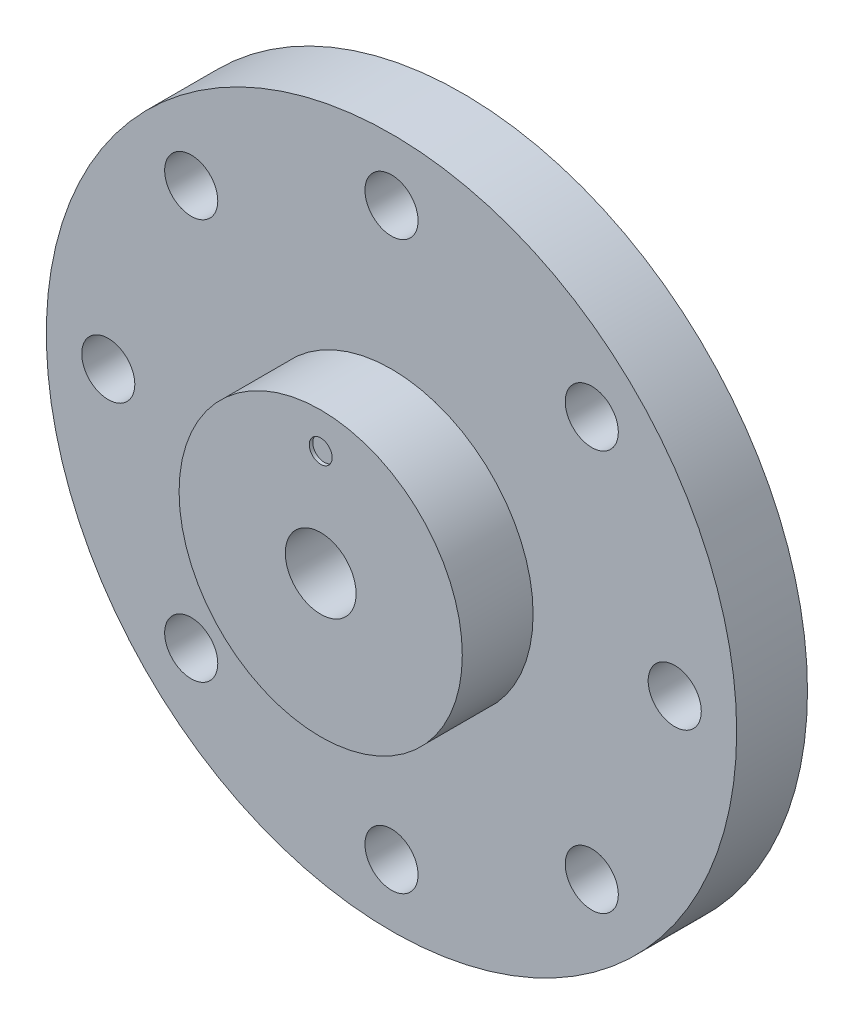
ISO-10303-21;
HEADER;
FILE_DESCRIPTION(('STEP AP214'),'2;1');
FILE_NAME('part.step','',(''),(''),'','','');
FILE_SCHEMA(('AUTOMOTIVE_DESIGN { 1 0 10303 214 1 1 1 1 }'));
ENDSEC;
DATA;
#1=APPLICATION_CONTEXT('core data for automotive mechanical design processes');
#2=APPLICATION_PROTOCOL_DEFINITION('international standard','automotive_design',2000,#1);
#3=PRODUCT_CONTEXT('',#1,'mechanical');
#4=PRODUCT('Part','Part','',(#3));
#5=PRODUCT_RELATED_PRODUCT_CATEGORY('part','',(#4));
#6=PRODUCT_DEFINITION_FORMATION('','',#4);
#7=PRODUCT_DEFINITION_CONTEXT('part definition',#1,'design');
#8=PRODUCT_DEFINITION('design','',#6,#7);
#9=PRODUCT_DEFINITION_SHAPE('','',#8);
#10=(LENGTH_UNIT() NAMED_UNIT(*) SI_UNIT(.MILLI.,.METRE.));
#11=(NAMED_UNIT(*) PLANE_ANGLE_UNIT() SI_UNIT($,.RADIAN.));
#12=(NAMED_UNIT(*) SI_UNIT($,.STERADIAN.) SOLID_ANGLE_UNIT());
#13=UNCERTAINTY_MEASURE_WITH_UNIT(LENGTH_MEASURE(1.E-05),#10,'distance_accuracy_value','');
#14=(GEOMETRIC_REPRESENTATION_CONTEXT(3) GLOBAL_UNCERTAINTY_ASSIGNED_CONTEXT((#13)) GLOBAL_UNIT_ASSIGNED_CONTEXT((#10,
#11,#12)) REPRESENTATION_CONTEXT('',''));
#15=CARTESIAN_POINT('',(0.,0.,0.));
#16=DIRECTION('',(0.,0.,1.));
#17=DIRECTION('',(1.,0.,0.));
#18=AXIS2_PLACEMENT_3D('',#15,#16,#17);
#19=CARTESIAN_POINT('',(0.,12.,20.));
#20=DIRECTION('',(0.,0.,1.));
#21=DIRECTION('',(1.,0.,0.));
#22=AXIS2_PLACEMENT_3D('',#19,#20,#21);
#23=PLANE('',#22);
#24=CARTESIAN_POINT('',(-5.65685424949228,17.6568542494924,20.));
#25=DIRECTION('',(0.,0.,1.));
#26=DIRECTION('',(1.,0.,0.));
#27=AXIS2_PLACEMENT_3D('',#24,#25,#26);
#28=CIRCLE('',#27,0.75);
#29=CARTESIAN_POINT('',(-4.90685424949228,17.6568542494924,20.));
#30=VERTEX_POINT('',#29);
#31=EDGE_CURVE('E48',#30,#30,#28,.T.);
#32=ORIENTED_EDGE('',*,*,#31,.F.);
#33=EDGE_LOOP('',(#32));
#34=FACE_BOUND('',#33,.T.);
#35=CARTESIAN_POINT('',(-8.00000000000012,12.,20.));
#36=DIRECTION('',(0.,0.,1.));
#37=DIRECTION('',(1.,0.,0.));
#38=AXIS2_PLACEMENT_3D('',#35,#36,#37);
#39=CIRCLE('',#38,0.750000000000018);
#40=CARTESIAN_POINT('',(-7.2500000000001,12.,20.));
#41=VERTEX_POINT('',#40);
#42=EDGE_CURVE('E59',#41,#41,#39,.T.);
#43=ORIENTED_EDGE('',*,*,#42,.F.);
#44=EDGE_LOOP('',(#43));
#45=FACE_BOUND('',#44,.T.);
#46=CARTESIAN_POINT('',(-5.65685424949246,6.34314575050743,20.));
#47=DIRECTION('',(0.,0.,1.));
#48=DIRECTION('',(1.,0.,0.));
#49=AXIS2_PLACEMENT_3D('',#46,#47,#48);
#50=CIRCLE('',#49,0.749999999999879);
#51=CARTESIAN_POINT('',(-4.90685424949258,6.34314575050743,20.));
#52=VERTEX_POINT('',#51);
#53=EDGE_CURVE('E68',#52,#52,#50,.T.);
#54=ORIENTED_EDGE('',*,*,#53,.F.);
#55=EDGE_LOOP('',(#54));
#56=FACE_BOUND('',#55,.T.);
#57=CARTESIAN_POINT('',(0.,3.99999999999978,20.));
#58=DIRECTION('',(0.,0.,1.));
#59=DIRECTION('',(1.,0.,0.));
#60=AXIS2_PLACEMENT_3D('',#57,#58,#59);
#61=CIRCLE('',#60,0.749999999999774);
#62=CARTESIAN_POINT('',(0.749999999999774,3.99999999999978,20.));
#63=VERTEX_POINT('',#62);
#64=EDGE_CURVE('E79',#63,#63,#61,.T.);
#65=ORIENTED_EDGE('',*,*,#64,.F.);
#66=EDGE_LOOP('',(#65));
#67=FACE_BOUND('',#66,.T.);
#68=CARTESIAN_POINT('',(5.65685424949246,6.34314575050743,20.));
#69=DIRECTION('',(0.,0.,1.));
#70=DIRECTION('',(1.,0.,0.));
#71=AXIS2_PLACEMENT_3D('',#68,#69,#70);
#72=CIRCLE('',#71,0.749999999999748);
#73=CARTESIAN_POINT('',(6.40685424949221,6.34314575050743,20.));
#74=VERTEX_POINT('',#73);
#75=EDGE_CURVE('E87',#74,#74,#72,.T.);
#76=ORIENTED_EDGE('',*,*,#75,.F.);
#77=EDGE_LOOP('',(#76));
#78=FACE_BOUND('',#77,.T.);
#79=CARTESIAN_POINT('',(8.00000000000011,12.,20.));
#80=DIRECTION('',(0.,0.,1.));
#81=DIRECTION('',(1.,0.,0.));
#82=AXIS2_PLACEMENT_3D('',#79,#80,#81);
#83=CIRCLE('',#82,0.749999999999814);
#84=CARTESIAN_POINT('',(8.74999999999992,12.,20.));
#85=VERTEX_POINT('',#84);
#86=EDGE_CURVE('E96',#85,#85,#83,.T.);
#87=ORIENTED_EDGE('',*,*,#86,.F.);
#88=EDGE_LOOP('',(#87));
#89=FACE_BOUND('',#88,.T.);
#90=CARTESIAN_POINT('',(5.65685424949246,17.6568542494924,20.));
#91=DIRECTION('',(0.,0.,1.));
#92=DIRECTION('',(1.,0.,0.));
#93=AXIS2_PLACEMENT_3D('',#90,#91,#92);
#94=CIRCLE('',#93,0.749999999999922);
#95=CARTESIAN_POINT('',(6.40685424949238,17.6568542494924,20.));
#96=VERTEX_POINT('',#95);
#97=EDGE_CURVE('E107',#96,#96,#94,.T.);
#98=ORIENTED_EDGE('',*,*,#97,.F.);
#99=EDGE_LOOP('',(#98));
#100=FACE_BOUND('',#99,.T.);
#101=CARTESIAN_POINT('',(0.,20.,20.));
#102=DIRECTION('',(0.,0.,1.));
#103=DIRECTION('',(1.,0.,0.));
#104=AXIS2_PLACEMENT_3D('',#101,#102,#103);
#105=CIRCLE('',#104,0.75);
#106=CARTESIAN_POINT('',(0.75,20.,20.));
#107=VERTEX_POINT('',#106);
#108=EDGE_CURVE('E115',#107,#107,#105,.T.);
#109=ORIENTED_EDGE('',*,*,#108,.F.);
#110=EDGE_LOOP('',(#109));
#111=FACE_BOUND('',#110,.T.);
#112=CARTESIAN_POINT('',(0.,12.,20.));
#113=DIRECTION('',(0.,0.,1.));
#114=DIRECTION('',(1.,0.,0.));
#115=AXIS2_PLACEMENT_3D('',#112,#113,#114);
#116=CIRCLE('',#115,9.75);
#117=CARTESIAN_POINT('',(9.75,12.,20.));
#118=VERTEX_POINT('',#117);
#119=EDGE_CURVE('E11',#118,#118,#116,.T.);
#120=ORIENTED_EDGE('',*,*,#119,.T.);
#121=EDGE_LOOP('',(#120));
#122=FACE_BOUND('',#121,.T.);
#123=CARTESIAN_POINT('',(0.,12.,20.));
#124=DIRECTION('',(0.,0.,1.));
#125=DIRECTION('',(1.,0.,0.));
#126=AXIS2_PLACEMENT_3D('',#123,#124,#125);
#127=CIRCLE('',#126,4.);
#128=CARTESIAN_POINT('',(4.,12.,20.));
#129=VERTEX_POINT('',#128);
#130=EDGE_CURVE('E39',#129,#129,#127,.T.);
#131=ORIENTED_EDGE('',*,*,#130,.F.);
#132=EDGE_LOOP('',(#131));
#133=FACE_BOUND('',#132,.T.);
#134=ADVANCED_FACE('F17',(#34,#45,#56,#67,#78,#89,#100,#111,#122,#133),#23,.T.);
#135=CARTESIAN_POINT('',(0.,12.,20.));
#136=DIRECTION('',(0.,0.,-1.));
#137=DIRECTION('',(-1.,0.,0.));
#138=AXIS2_PLACEMENT_3D('',#135,#136,#137);
#139=CYLINDRICAL_SURFACE('',#138,9.75);
#140=ORIENTED_EDGE('',*,*,#119,.F.);
#141=EDGE_LOOP('',(#140));
#142=FACE_BOUND('',#141,.T.);
#143=CARTESIAN_POINT('',(0.,12.,18.));
#144=DIRECTION('',(0.,0.,1.));
#145=DIRECTION('',(1.,0.,0.));
#146=AXIS2_PLACEMENT_3D('',#143,#144,#145);
#147=CIRCLE('',#146,9.75);
#148=CARTESIAN_POINT('',(9.75,12.,18.));
#149=VERTEX_POINT('',#148);
#150=EDGE_CURVE('E21',#149,#149,#147,.T.);
#151=ORIENTED_EDGE('',*,*,#150,.T.);
#152=EDGE_LOOP('',(#151));
#153=FACE_BOUND('',#152,.T.);
#154=ADVANCED_FACE('F19',(#142,#153),#139,.T.);
#155=CARTESIAN_POINT('',(0.,12.,18.));
#156=DIRECTION('',(0.,0.,1.));
#157=DIRECTION('',(1.,0.,0.));
#158=AXIS2_PLACEMENT_3D('',#155,#156,#157);
#159=PLANE('',#158);
#160=CARTESIAN_POINT('',(0.,12.,18.));
#161=DIRECTION('',(0.,0.,1.));
#162=DIRECTION('',(1.,0.,0.));
#163=AXIS2_PLACEMENT_3D('',#160,#161,#162);
#164=CIRCLE('',#163,1.);
#165=CARTESIAN_POINT('',(1.,12.,18.));
#166=VERTEX_POINT('',#165);
#167=EDGE_CURVE('E55',#166,#166,#164,.F.);
#168=ORIENTED_EDGE('',*,*,#167,.F.);
#169=EDGE_LOOP('',(#168));
#170=FACE_BOUND('',#169,.T.);
#171=CARTESIAN_POINT('',(-5.65685424949228,17.6568542494924,18.));
#172=DIRECTION('',(0.,0.,1.));
#173=DIRECTION('',(1.,0.,0.));
#174=AXIS2_PLACEMENT_3D('',#171,#172,#173);
#175=CIRCLE('',#174,0.75);
#176=CARTESIAN_POINT('',(-4.90685424949228,17.6568542494924,18.));
#177=VERTEX_POINT('',#176);
#178=EDGE_CURVE('E54',#177,#177,#175,.F.);
#179=ORIENTED_EDGE('',*,*,#178,.F.);
#180=EDGE_LOOP('',(#179));
#181=FACE_BOUND('',#180,.T.);
#182=CARTESIAN_POINT('',(-8.00000000000012,12.,18.));
#183=DIRECTION('',(0.,0.,1.));
#184=DIRECTION('',(1.,0.,0.));
#185=AXIS2_PLACEMENT_3D('',#182,#183,#184);
#186=CIRCLE('',#185,0.750000000000018);
#187=CARTESIAN_POINT('',(-7.2500000000001,12.,18.));
#188=VERTEX_POINT('',#187);
#189=EDGE_CURVE('E64',#188,#188,#186,.F.);
#190=ORIENTED_EDGE('',*,*,#189,.F.);
#191=EDGE_LOOP('',(#190));
#192=FACE_BOUND('',#191,.T.);
#193=CARTESIAN_POINT('',(-5.65685424949246,6.34314575050743,18.));
#194=DIRECTION('',(0.,0.,1.));
#195=DIRECTION('',(1.,0.,0.));
#196=AXIS2_PLACEMENT_3D('',#193,#194,#195);
#197=CIRCLE('',#196,0.749999999999879);
#198=CARTESIAN_POINT('',(-4.90685424949258,6.34314575050743,18.));
#199=VERTEX_POINT('',#198);
#200=EDGE_CURVE('E73',#199,#199,#197,.F.);
#201=ORIENTED_EDGE('',*,*,#200,.F.);
#202=EDGE_LOOP('',(#201));
#203=FACE_BOUND('',#202,.T.);
#204=CARTESIAN_POINT('',(0.,3.99999999999978,18.));
#205=DIRECTION('',(0.,0.,1.));
#206=DIRECTION('',(1.,0.,0.));
#207=AXIS2_PLACEMENT_3D('',#204,#205,#206);
#208=CIRCLE('',#207,0.749999999999774);
#209=CARTESIAN_POINT('',(0.749999999999774,3.99999999999978,18.));
#210=VERTEX_POINT('',#209);
#211=EDGE_CURVE('E84',#210,#210,#208,.F.);
#212=ORIENTED_EDGE('',*,*,#211,.F.);
#213=EDGE_LOOP('',(#212));
#214=FACE_BOUND('',#213,.T.);
#215=CARTESIAN_POINT('',(5.65685424949246,6.34314575050743,18.));
#216=DIRECTION('',(0.,0.,1.));
#217=DIRECTION('',(1.,0.,0.));
#218=AXIS2_PLACEMENT_3D('',#215,#216,#217);
#219=CIRCLE('',#218,0.749999999999748);
#220=CARTESIAN_POINT('',(6.40685424949221,6.34314575050743,18.));
#221=VERTEX_POINT('',#220);
#222=EDGE_CURVE('E92',#221,#221,#219,.F.);
#223=ORIENTED_EDGE('',*,*,#222,.F.);
#224=EDGE_LOOP('',(#223));
#225=FACE_BOUND('',#224,.T.);
#226=CARTESIAN_POINT('',(8.00000000000011,12.,18.));
#227=DIRECTION('',(0.,0.,1.));
#228=DIRECTION('',(1.,0.,0.));
#229=AXIS2_PLACEMENT_3D('',#226,#227,#228);
#230=CIRCLE('',#229,0.749999999999814);
#231=CARTESIAN_POINT('',(8.74999999999992,12.,18.));
#232=VERTEX_POINT('',#231);
#233=EDGE_CURVE('E101',#232,#232,#230,.F.);
#234=ORIENTED_EDGE('',*,*,#233,.F.);
#235=EDGE_LOOP('',(#234));
#236=FACE_BOUND('',#235,.T.);
#237=CARTESIAN_POINT('',(5.65685424949246,17.6568542494924,18.));
#238=DIRECTION('',(0.,0.,1.));
#239=DIRECTION('',(1.,0.,0.));
#240=AXIS2_PLACEMENT_3D('',#237,#238,#239);
#241=CIRCLE('',#240,0.749999999999922);
#242=CARTESIAN_POINT('',(6.40685424949238,17.6568542494924,18.));
#243=VERTEX_POINT('',#242);
#244=EDGE_CURVE('E112',#243,#243,#241,.F.);
#245=ORIENTED_EDGE('',*,*,#244,.F.);
#246=EDGE_LOOP('',(#245));
#247=FACE_BOUND('',#246,.T.);
#248=CARTESIAN_POINT('',(0.,20.,18.));
#249=DIRECTION('',(0.,0.,1.));
#250=DIRECTION('',(1.,0.,0.));
#251=AXIS2_PLACEMENT_3D('',#248,#249,#250);
#252=CIRCLE('',#251,0.75);
#253=CARTESIAN_POINT('',(0.75,20.,18.));
#254=VERTEX_POINT('',#253);
#255=EDGE_CURVE('E120',#254,#254,#252,.F.);
#256=ORIENTED_EDGE('',*,*,#255,.F.);
#257=EDGE_LOOP('',(#256));
#258=FACE_BOUND('',#257,.T.);
#259=ORIENTED_EDGE('',*,*,#150,.F.);
#260=EDGE_LOOP('',(#259));
#261=FACE_BOUND('',#260,.T.);
#262=ADVANCED_FACE('F174',(#170,#181,#192,#203,#214,#225,#236,#247,#258,#261),#159,.F.);
#263=CARTESIAN_POINT('',(0.,12.,22.));
#264=DIRECTION('',(0.,0.,-1.));
#265=DIRECTION('',(-1.,0.,0.));
#266=AXIS2_PLACEMENT_3D('',#263,#264,#265);
#267=CYLINDRICAL_SURFACE('',#266,4.);
#268=CARTESIAN_POINT('',(0.,12.,22.));
#269=DIRECTION('',(0.,0.,1.));
#270=DIRECTION('',(1.,0.,0.));
#271=AXIS2_PLACEMENT_3D('',#268,#269,#270);
#272=CIRCLE('',#271,4.);
#273=CARTESIAN_POINT('',(4.,12.,22.));
#274=VERTEX_POINT('',#273);
#275=EDGE_CURVE('E36',#274,#274,#272,.T.);
#276=ORIENTED_EDGE('',*,*,#275,.F.);
#277=EDGE_LOOP('',(#276));
#278=FACE_BOUND('',#277,.T.);
#279=ORIENTED_EDGE('',*,*,#130,.T.);
#280=EDGE_LOOP('',(#279));
#281=FACE_BOUND('',#280,.T.);
#282=ADVANCED_FACE('F167',(#278,#281),#267,.T.);
#283=CARTESIAN_POINT('',(0.,12.,22.));
#284=DIRECTION('',(0.,0.,1.));
#285=DIRECTION('',(1.,0.,0.));
#286=AXIS2_PLACEMENT_3D('',#283,#284,#285);
#287=PLANE('',#286);
#288=CARTESIAN_POINT('',(0.,14.9902745662428,22.));
#289=DIRECTION('',(0.,0.,1.));
#290=DIRECTION('',(1.,0.,0.));
#291=AXIS2_PLACEMENT_3D('',#288,#289,#290);
#292=CIRCLE('',#291,0.322728198796921);
#293=CARTESIAN_POINT('',(0.322728198796921,14.9902745662428,22.));
#294=VERTEX_POINT('',#293);
#295=EDGE_CURVE('E130',#294,#294,#292,.T.);
#296=ORIENTED_EDGE('',*,*,#295,.F.);
#297=EDGE_LOOP('',(#296));
#298=FACE_BOUND('',#297,.T.);
#299=CARTESIAN_POINT('',(0.,12.,22.));
#300=DIRECTION('',(0.,0.,1.));
#301=DIRECTION('',(1.,0.,0.));
#302=AXIS2_PLACEMENT_3D('',#299,#300,#301);
#303=CIRCLE('',#302,1.);
#304=CARTESIAN_POINT('',(1.,12.,22.));
#305=VERTEX_POINT('',#304);
#306=EDGE_CURVE('E136',#305,#305,#303,.T.);
#307=ORIENTED_EDGE('',*,*,#306,.F.);
#308=EDGE_LOOP('',(#307));
#309=FACE_BOUND('',#308,.T.);
#310=ORIENTED_EDGE('',*,*,#275,.T.);
#311=EDGE_LOOP('',(#310));
#312=FACE_BOUND('',#311,.T.);
#313=ADVANCED_FACE('F163',(#298,#309,#312),#287,.T.);
#314=CARTESIAN_POINT('',(0.,20.,-8.501));
#315=DIRECTION('',(0.,0.,1.));
#316=DIRECTION('',(1.,0.,0.));
#317=AXIS2_PLACEMENT_3D('',#314,#315,#316);
#318=CYLINDRICAL_SURFACE('',#317,0.75);
#319=ORIENTED_EDGE('',*,*,#108,.T.);
#320=EDGE_LOOP('',(#319));
#321=FACE_BOUND('',#320,.T.);
#322=ORIENTED_EDGE('',*,*,#255,.T.);
#323=EDGE_LOOP('',(#322));
#324=FACE_BOUND('',#323,.T.);
#325=ADVANCED_FACE('F166',(#321,#324),#318,.F.);
#326=CARTESIAN_POINT('',(5.65685424949246,17.6568542494924,-8.501));
#327=DIRECTION('',(0.,0.,1.));
#328=DIRECTION('',(1.,0.,0.));
#329=AXIS2_PLACEMENT_3D('',#326,#327,#328);
#330=CYLINDRICAL_SURFACE('',#329,0.749999999999922);
#331=ORIENTED_EDGE('',*,*,#97,.T.);
#332=EDGE_LOOP('',(#331));
#333=FACE_BOUND('',#332,.T.);
#334=ORIENTED_EDGE('',*,*,#244,.T.);
#335=EDGE_LOOP('',(#334));
#336=FACE_BOUND('',#335,.T.);
#337=ADVANCED_FACE('F224',(#333,#336),#330,.F.);
#338=CARTESIAN_POINT('',(8.00000000000011,12.,-8.501));
#339=DIRECTION('',(0.,0.,1.));
#340=DIRECTION('',(1.,0.,0.));
#341=AXIS2_PLACEMENT_3D('',#338,#339,#340);
#342=CYLINDRICAL_SURFACE('',#341,0.749999999999814);
#343=ORIENTED_EDGE('',*,*,#86,.T.);
#344=EDGE_LOOP('',(#343));
#345=FACE_BOUND('',#344,.T.);
#346=ORIENTED_EDGE('',*,*,#233,.T.);
#347=EDGE_LOOP('',(#346));
#348=FACE_BOUND('',#347,.T.);
#349=ADVANCED_FACE('F241',(#345,#348),#342,.F.);
#350=CARTESIAN_POINT('',(5.65685424949246,6.34314575050743,-8.501));
#351=DIRECTION('',(0.,0.,1.));
#352=DIRECTION('',(1.,0.,0.));
#353=AXIS2_PLACEMENT_3D('',#350,#351,#352);
#354=CYLINDRICAL_SURFACE('',#353,0.749999999999748);
#355=ORIENTED_EDGE('',*,*,#75,.T.);
#356=EDGE_LOOP('',(#355));
#357=FACE_BOUND('',#356,.T.);
#358=ORIENTED_EDGE('',*,*,#222,.T.);
#359=EDGE_LOOP('',(#358));
#360=FACE_BOUND('',#359,.T.);
#361=ADVANCED_FACE('F260',(#357,#360),#354,.F.);
#362=CARTESIAN_POINT('',(0.,3.99999999999978,-8.501));
#363=DIRECTION('',(0.,0.,1.));
#364=DIRECTION('',(1.,0.,0.));
#365=AXIS2_PLACEMENT_3D('',#362,#363,#364);
#366=CYLINDRICAL_SURFACE('',#365,0.749999999999774);
#367=ORIENTED_EDGE('',*,*,#64,.T.);
#368=EDGE_LOOP('',(#367));
#369=FACE_BOUND('',#368,.T.);
#370=ORIENTED_EDGE('',*,*,#211,.T.);
#371=EDGE_LOOP('',(#370));
#372=FACE_BOUND('',#371,.T.);
#373=ADVANCED_FACE('F277',(#369,#372),#366,.F.);
#374=CARTESIAN_POINT('',(-5.65685424949246,6.34314575050743,-8.501));
#375=DIRECTION('',(0.,0.,1.));
#376=DIRECTION('',(1.,0.,0.));
#377=AXIS2_PLACEMENT_3D('',#374,#375,#376);
#378=CYLINDRICAL_SURFACE('',#377,0.749999999999879);
#379=ORIENTED_EDGE('',*,*,#53,.T.);
#380=EDGE_LOOP('',(#379));
#381=FACE_BOUND('',#380,.T.);
#382=ORIENTED_EDGE('',*,*,#200,.T.);
#383=EDGE_LOOP('',(#382));
#384=FACE_BOUND('',#383,.T.);
#385=ADVANCED_FACE('F294',(#381,#384),#378,.F.);
#386=CARTESIAN_POINT('',(-8.00000000000012,12.,-8.501));
#387=DIRECTION('',(0.,0.,1.));
#388=DIRECTION('',(1.,0.,0.));
#389=AXIS2_PLACEMENT_3D('',#386,#387,#388);
#390=CYLINDRICAL_SURFACE('',#389,0.750000000000018);
#391=ORIENTED_EDGE('',*,*,#42,.T.);
#392=EDGE_LOOP('',(#391));
#393=FACE_BOUND('',#392,.T.);
#394=ORIENTED_EDGE('',*,*,#189,.T.);
#395=EDGE_LOOP('',(#394));
#396=FACE_BOUND('',#395,.T.);
#397=ADVANCED_FACE('F313',(#393,#396),#390,.F.);
#398=CARTESIAN_POINT('',(-5.65685424949228,17.6568542494924,-8.501));
#399=DIRECTION('',(0.,0.,1.));
#400=DIRECTION('',(1.,0.,0.));
#401=AXIS2_PLACEMENT_3D('',#398,#399,#400);
#402=CYLINDRICAL_SURFACE('',#401,0.75);
#403=ORIENTED_EDGE('',*,*,#31,.T.);
#404=EDGE_LOOP('',(#403));
#405=FACE_BOUND('',#404,.T.);
#406=ORIENTED_EDGE('',*,*,#178,.T.);
#407=EDGE_LOOP('',(#406));
#408=FACE_BOUND('',#407,.T.);
#409=ADVANCED_FACE('F330',(#405,#408),#402,.F.);
#410=CARTESIAN_POINT('',(0.,12.,-19.001));
#411=DIRECTION('',(0.,0.,1.));
#412=DIRECTION('',(1.,0.,0.));
#413=AXIS2_PLACEMENT_3D('',#410,#411,#412);
#414=CYLINDRICAL_SURFACE('',#413,1.);
#415=ORIENTED_EDGE('',*,*,#306,.T.);
#416=EDGE_LOOP('',(#415));
#417=FACE_BOUND('',#416,.T.);
#418=ORIENTED_EDGE('',*,*,#167,.T.);
#419=EDGE_LOOP('',(#418));
#420=FACE_BOUND('',#419,.T.);
#421=ADVANCED_FACE('F159',(#417,#420),#414,.F.);
#422=CARTESIAN_POINT('',(0.,14.9902745662428,21.9));
#423=DIRECTION('',(0.,0.,1.));
#424=DIRECTION('',(1.,0.,0.));
#425=AXIS2_PLACEMENT_3D('',#422,#423,#424);
#426=CYLINDRICAL_SURFACE('',#425,0.322728198796921);
#427=CARTESIAN_POINT('',(0.,14.9902745662428,21.9));
#428=DIRECTION('',(0.,0.,1.));
#429=DIRECTION('',(1.,0.,0.));
#430=AXIS2_PLACEMENT_3D('',#427,#428,#429);
#431=CIRCLE('',#430,0.322728198796921);
#432=CARTESIAN_POINT('',(0.322728198796921,14.9902745662428,21.9));
#433=VERTEX_POINT('',#432);
#434=EDGE_CURVE('E134',#433,#433,#431,.T.);
#435=ORIENTED_EDGE('',*,*,#434,.F.);
#436=EDGE_LOOP('',(#435));
#437=FACE_BOUND('',#436,.T.);
#438=ORIENTED_EDGE('',*,*,#295,.T.);
#439=EDGE_LOOP('',(#438));
#440=FACE_BOUND('',#439,.T.);
#441=ADVANCED_FACE('F156',(#437,#440),#426,.F.);
#442=CARTESIAN_POINT('',(0.,14.9902745662428,21.9));
#443=DIRECTION('',(0.,0.,1.));
#444=DIRECTION('',(1.,0.,0.));
#445=AXIS2_PLACEMENT_3D('',#442,#443,#444);
#446=PLANE('',#445);
#447=ORIENTED_EDGE('',*,*,#434,.T.);
#448=EDGE_LOOP('',(#447));
#449=FACE_BOUND('',#448,.T.);
#450=ADVANCED_FACE('F154',(#449),#446,.T.);
#451=CLOSED_SHELL('',(#134,#154,#262,#282,#313,#325,#337,#349,#361,#373,#385,#397,#409,#421,
#441,#450));
#452=MANIFOLD_SOLID_BREP('B1',#451);
#453=ADVANCED_BREP_SHAPE_REPRESENTATION('',(#18,#452),#14);
#454=SHAPE_DEFINITION_REPRESENTATION(#9,#453);
ENDSEC;
END-ISO-10303-21;
